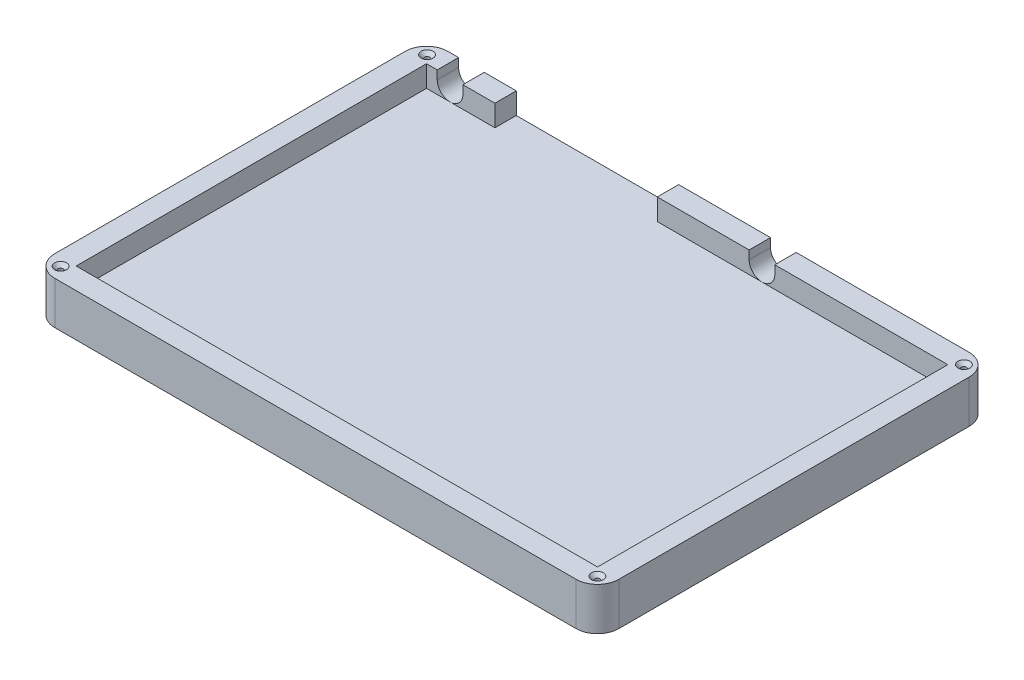
ISO-10303-21;
HEADER;
FILE_DESCRIPTION(('STEP AP214'),'2;1');
FILE_NAME('part.step','',(''),(''),'','','');
FILE_SCHEMA(('AUTOMOTIVE_DESIGN { 1 0 10303 214 1 1 1 1 }'));
ENDSEC;
DATA;
#1=APPLICATION_CONTEXT('core data for automotive mechanical design processes');
#2=APPLICATION_PROTOCOL_DEFINITION('international standard','automotive_design',2000,#1);
#3=PRODUCT_CONTEXT('',#1,'mechanical');
#4=PRODUCT('Part','Part','',(#3));
#5=PRODUCT_RELATED_PRODUCT_CATEGORY('part','',(#4));
#6=PRODUCT_DEFINITION_FORMATION('','',#4);
#7=PRODUCT_DEFINITION_CONTEXT('part definition',#1,'design');
#8=PRODUCT_DEFINITION('design','',#6,#7);
#9=PRODUCT_DEFINITION_SHAPE('','',#8);
#10=(LENGTH_UNIT() NAMED_UNIT(*) SI_UNIT(.MILLI.,.METRE.));
#11=(NAMED_UNIT(*) PLANE_ANGLE_UNIT() SI_UNIT($,.RADIAN.));
#12=(NAMED_UNIT(*) SI_UNIT($,.STERADIAN.) SOLID_ANGLE_UNIT());
#13=UNCERTAINTY_MEASURE_WITH_UNIT(LENGTH_MEASURE(1.E-05),#10,'distance_accuracy_value','');
#14=(GEOMETRIC_REPRESENTATION_CONTEXT(3) GLOBAL_UNCERTAINTY_ASSIGNED_CONTEXT((#13)) GLOBAL_UNIT_ASSIGNED_CONTEXT((#10,
#11,#12)) REPRESENTATION_CONTEXT('',''));
#15=CARTESIAN_POINT('',(0.,0.,0.));
#16=DIRECTION('',(0.,0.,1.));
#17=DIRECTION('',(1.,0.,0.));
#18=AXIS2_PLACEMENT_3D('',#15,#16,#17);
#19=CARTESIAN_POINT('',(-61.,10.,41.));
#20=DIRECTION('',(0.,-1.,0.));
#21=DIRECTION('',(0.,0.,-1.));
#22=AXIS2_PLACEMENT_3D('',#19,#20,#21);
#23=PLANE('',#22);
#24=DIRECTION('',(0.,0.,-1.));
#25=VECTOR('',#24,1.);
#26=CARTESIAN_POINT('',(-52.5,10.,-33.1897503240934));
#27=LINE('',#26,#25);
#28=CARTESIAN_POINT('',(-52.5,10.,-41.));
#29=VERTEX_POINT('',#28);
#30=CARTESIAN_POINT('',(-52.5,10.,-46.));
#31=VERTEX_POINT('',#30);
#32=EDGE_CURVE('E268',#29,#31,#27,.T.);
#33=ORIENTED_EDGE('',*,*,#32,.F.);
#34=DIRECTION('',(-1.,0.,0.));
#35=VECTOR('',#34,1.);
#36=CARTESIAN_POINT('',(-61.,10.,-41.));
#37=LINE('',#36,#35);
#38=CARTESIAN_POINT('',(-45.,10.,-41.));
#39=VERTEX_POINT('',#38);
#40=EDGE_CURVE('E247',#39,#29,#37,.T.);
#41=ORIENTED_EDGE('',*,*,#40,.F.);
#42=DIRECTION('',(0.,0.,1.));
#43=VECTOR('',#42,1.);
#44=CARTESIAN_POINT('',(-45.,10.,-46.));
#45=LINE('',#44,#43);
#46=CARTESIAN_POINT('',(-45.,10.,-46.));
#47=VERTEX_POINT('',#46);
#48=EDGE_CURVE('E306',#47,#39,#45,.T.);
#49=ORIENTED_EDGE('',*,*,#48,.F.);
#50=DIRECTION('',(-1.,0.,0.));
#51=VECTOR('',#50,1.);
#52=CARTESIAN_POINT('',(-61.,10.,-46.));
#53=LINE('',#52,#51);
#54=EDGE_CURVE('E448',#47,#31,#53,.T.);
#55=ORIENTED_EDGE('',*,*,#54,.T.);
#56=EDGE_LOOP('',(#33,#41,#49,#55));
#57=FACE_BOUND('',#56,.T.);
#58=ADVANCED_FACE('F50',(#57),#23,.F.);
#59=CARTESIAN_POINT('',(-61.,10.,-41.));
#60=DIRECTION('',(0.,0.,1.));
#61=DIRECTION('',(1.,0.,0.));
#62=AXIS2_PLACEMENT_3D('',#59,#60,#61);
#63=PLANE('',#62);
#64=CARTESIAN_POINT('',(-55.5,8.,-41.));
#65=DIRECTION('',(0.,0.,1.));
#66=DIRECTION('',(1.,0.,0.));
#67=AXIS2_PLACEMENT_3D('',#64,#65,#66);
#68=CIRCLE('',#67,3.);
#69=CARTESIAN_POINT('',(-55.5,5.,-41.));
#70=VERTEX_POINT('',#69);
#71=CARTESIAN_POINT('',(-58.5,8.,-41.));
#72=VERTEX_POINT('',#71);
#73=EDGE_CURVE('E233',#70,#72,#68,.F.);
#74=ORIENTED_EDGE('',*,*,#73,.T.);
#75=DIRECTION('',(0.,1.,0.));
#76=VECTOR('',#75,1.);
#77=CARTESIAN_POINT('',(-58.5,8.,-41.));
#78=LINE('',#77,#76);
#79=CARTESIAN_POINT('',(-58.5,10.,-41.));
#80=VERTEX_POINT('',#79);
#81=EDGE_CURVE('E257',#72,#80,#78,.T.);
#82=ORIENTED_EDGE('',*,*,#81,.T.);
#83=CARTESIAN_POINT('',(-61.,10.,-41.));
#84=VERTEX_POINT('',#83);
#85=EDGE_CURVE('E396',#80,#84,#37,.T.);
#86=ORIENTED_EDGE('',*,*,#85,.T.);
#87=DIRECTION('',(0.,-1.,0.));
#88=VECTOR('',#87,1.);
#89=CARTESIAN_POINT('',(-61.,10.,-41.));
#90=LINE('',#89,#88);
#91=CARTESIAN_POINT('',(-61.,5.,-41.));
#92=VERTEX_POINT('',#91);
#93=EDGE_CURVE('E405',#84,#92,#90,.T.);
#94=ORIENTED_EDGE('',*,*,#93,.T.);
#95=DIRECTION('',(1.,0.,0.));
#96=VECTOR('',#95,1.);
#97=CARTESIAN_POINT('',(0.,5.,-41.));
#98=LINE('',#97,#96);
#99=EDGE_CURVE('E452',#92,#70,#98,.T.);
#100=ORIENTED_EDGE('',*,*,#99,.T.);
#101=EDGE_LOOP('',(#74,#82,#86,#94,#100));
#102=FACE_BOUND('',#101,.T.);
#103=ADVANCED_FACE('F612',(#102),#63,.T.);
#104=DIRECTION('',(0.,-1.,0.));
#105=VECTOR('',#104,1.);
#106=CARTESIAN_POINT('',(-52.5,10.,-41.));
#107=LINE('',#106,#105);
#108=CARTESIAN_POINT('',(-52.5,8.,-41.));
#109=VERTEX_POINT('',#108);
#110=EDGE_CURVE('E245',#29,#109,#107,.T.);
#111=ORIENTED_EDGE('',*,*,#110,.T.);
#112=EDGE_CURVE('E230',#109,#70,#68,.F.);
#113=ORIENTED_EDGE('',*,*,#112,.T.);
#114=CARTESIAN_POINT('',(-45.,5.,-41.));
#115=VERTEX_POINT('',#114);
#116=EDGE_CURVE('E458',#70,#115,#98,.T.);
#117=ORIENTED_EDGE('',*,*,#116,.T.);
#118=DIRECTION('',(0.,1.,0.));
#119=VECTOR('',#118,1.);
#120=CARTESIAN_POINT('',(-45.,-33.3275357934736,-41.));
#121=LINE('',#120,#119);
#122=EDGE_CURVE('E330',#115,#39,#121,.T.);
#123=ORIENTED_EDGE('',*,*,#122,.T.);
#124=ORIENTED_EDGE('',*,*,#40,.T.);
#125=EDGE_LOOP('',(#111,#113,#117,#123,#124));
#126=FACE_BOUND('',#125,.T.);
#127=ADVANCED_FACE('F246',(#126),#63,.T.);
#128=CARTESIAN_POINT('',(62.8800410539882,10.,-42.8891256748782));
#129=DIRECTION('',(0.,1.,0.));
#130=DIRECTION('',(0.,0.,1.));
#131=AXIS2_PLACEMENT_3D('',#128,#129,#130);
#132=CIRCLE('',#131,1.397);
#133=CARTESIAN_POINT('',(62.8800410539882,10.,-41.4921256748782));
#134=VERTEX_POINT('',#133);
#135=EDGE_CURVE('E319',#134,#134,#132,.T.);
#136=ORIENTED_EDGE('',*,*,#135,.F.);
#137=EDGE_LOOP('',(#136));
#138=FACE_BOUND('',#137,.T.);
#139=CARTESIAN_POINT('',(62.8800410539882,10.,42.8803024114659));
#140=DIRECTION('',(0.,1.,0.));
#141=DIRECTION('',(0.,0.,1.));
#142=AXIS2_PLACEMENT_3D('',#139,#140,#141);
#143=CIRCLE('',#142,1.397);
#144=CARTESIAN_POINT('',(62.8800410539882,10.,44.2773024114659));
#145=VERTEX_POINT('',#144);
#146=EDGE_CURVE('E353',#145,#145,#143,.T.);
#147=ORIENTED_EDGE('',*,*,#146,.F.);
#148=EDGE_LOOP('',(#147));
#149=FACE_BOUND('',#148,.T.);
#150=CARTESIAN_POINT('',(-62.7584309253833,10.,-42.8891256748782));
#151=DIRECTION('',(0.,1.,0.));
#152=DIRECTION('',(0.,0.,1.));
#153=AXIS2_PLACEMENT_3D('',#150,#151,#152);
#154=CIRCLE('',#153,1.397);
#155=CARTESIAN_POINT('',(-62.7584309253833,10.,-41.4921256748782));
#156=VERTEX_POINT('',#155);
#157=EDGE_CURVE('E361',#156,#156,#154,.T.);
#158=ORIENTED_EDGE('',*,*,#157,.F.);
#159=EDGE_LOOP('',(#158));
#160=FACE_BOUND('',#159,.T.);
#161=CARTESIAN_POINT('',(-62.7584309253833,10.,42.8803024114659));
#162=DIRECTION('',(0.,1.,0.));
#163=DIRECTION('',(0.,0.,1.));
#164=AXIS2_PLACEMENT_3D('',#161,#162,#163);
#165=CIRCLE('',#164,1.397);
#166=CARTESIAN_POINT('',(-62.7584309253833,10.,44.2773024114659));
#167=VERTEX_POINT('',#166);
#168=EDGE_CURVE('E374',#167,#167,#165,.T.);
#169=ORIENTED_EDGE('',*,*,#168,.F.);
#170=EDGE_LOOP('',(#169));
#171=FACE_BOUND('',#170,.T.);
#172=ORIENTED_EDGE('',*,*,#85,.F.);
#173=DIRECTION('',(0.,0.,-1.));
#174=VECTOR('',#173,1.);
#175=CARTESIAN_POINT('',(-58.5,10.,-33.1897503240934));
#176=LINE('',#175,#174);
#177=CARTESIAN_POINT('',(-58.5,10.,-46.));
#178=VERTEX_POINT('',#177);
#179=EDGE_CURVE('E263',#80,#178,#176,.T.);
#180=ORIENTED_EDGE('',*,*,#179,.T.);
#181=CARTESIAN_POINT('',(-61.,10.,-46.));
#182=VERTEX_POINT('',#181);
#183=EDGE_CURVE('E438',#178,#182,#53,.T.);
#184=ORIENTED_EDGE('',*,*,#183,.T.);
#185=CARTESIAN_POINT('',(-61.,10.,-41.));
#186=DIRECTION('',(0.,1.,0.));
#187=DIRECTION('',(0.,0.,-1.));
#188=AXIS2_PLACEMENT_3D('',#185,#186,#187);
#189=CIRCLE('',#188,5.);
#190=CARTESIAN_POINT('',(-66.,10.,-41.));
#191=VERTEX_POINT('',#190);
#192=EDGE_CURVE('E441',#182,#191,#189,.T.);
#193=ORIENTED_EDGE('',*,*,#192,.T.);
#194=DIRECTION('',(0.,0.,1.));
#195=VECTOR('',#194,1.);
#196=CARTESIAN_POINT('',(-66.,10.,41.));
#197=LINE('',#196,#195);
#198=CARTESIAN_POINT('',(-66.,10.,41.));
#199=VERTEX_POINT('',#198);
#200=EDGE_CURVE('E447',#191,#199,#197,.T.);
#201=ORIENTED_EDGE('',*,*,#200,.T.);
#202=CARTESIAN_POINT('',(-61.,10.,41.));
#203=DIRECTION('',(0.,1.,0.));
#204=DIRECTION('',(0.,0.,-1.));
#205=AXIS2_PLACEMENT_3D('',#202,#203,#204);
#206=CIRCLE('',#205,5.);
#207=CARTESIAN_POINT('',(-61.,10.,46.));
#208=VERTEX_POINT('',#207);
#209=EDGE_CURVE('E420',#199,#208,#206,.T.);
#210=ORIENTED_EDGE('',*,*,#209,.T.);
#211=DIRECTION('',(1.,0.,0.));
#212=VECTOR('',#211,1.);
#213=CARTESIAN_POINT('',(-61.,10.,46.));
#214=LINE('',#213,#212);
#215=CARTESIAN_POINT('',(61.,10.,46.));
#216=VERTEX_POINT('',#215);
#217=EDGE_CURVE('E421',#208,#216,#214,.T.);
#218=ORIENTED_EDGE('',*,*,#217,.T.);
#219=CARTESIAN_POINT('',(61.,10.,41.));
#220=DIRECTION('',(0.,1.,0.));
#221=DIRECTION('',(0.,0.,1.));
#222=AXIS2_PLACEMENT_3D('',#219,#220,#221);
#223=CIRCLE('',#222,5.);
#224=CARTESIAN_POINT('',(66.,10.,41.));
#225=VERTEX_POINT('',#224);
#226=EDGE_CURVE('E430',#216,#225,#223,.T.);
#227=ORIENTED_EDGE('',*,*,#226,.T.);
#228=DIRECTION('',(0.,0.,-1.));
#229=VECTOR('',#228,1.);
#230=CARTESIAN_POINT('',(66.,10.,41.));
#231=LINE('',#230,#229);
#232=CARTESIAN_POINT('',(66.,10.,-41.));
#233=VERTEX_POINT('',#232);
#234=EDGE_CURVE('E431',#225,#233,#231,.T.);
#235=ORIENTED_EDGE('',*,*,#234,.T.);
#236=CARTESIAN_POINT('',(61.,10.,-41.));
#237=DIRECTION('',(0.,1.,0.));
#238=DIRECTION('',(0.,0.,-1.));
#239=AXIS2_PLACEMENT_3D('',#236,#237,#238);
#240=CIRCLE('',#239,5.);
#241=CARTESIAN_POINT('',(61.,10.,-46.));
#242=VERTEX_POINT('',#241);
#243=EDGE_CURVE('E434',#233,#242,#240,.T.);
#244=ORIENTED_EDGE('',*,*,#243,.T.);
#245=CARTESIAN_POINT('',(20.5,10.,-46.));
#246=VERTEX_POINT('',#245);
#247=EDGE_CURVE('E439',#242,#246,#53,.T.);
#248=ORIENTED_EDGE('',*,*,#247,.T.);
#249=DIRECTION('',(0.,0.,-1.));
#250=VECTOR('',#249,1.);
#251=CARTESIAN_POINT('',(20.5,10.,-33.1897503240934));
#252=LINE('',#251,#250);
#253=CARTESIAN_POINT('',(20.5,10.,-41.));
#254=VERTEX_POINT('',#253);
#255=EDGE_CURVE('E304',#254,#246,#252,.T.);
#256=ORIENTED_EDGE('',*,*,#255,.F.);
#257=CARTESIAN_POINT('',(61.,10.,-41.));
#258=VERTEX_POINT('',#257);
#259=EDGE_CURVE('E400',#258,#254,#37,.T.);
#260=ORIENTED_EDGE('',*,*,#259,.F.);
#261=DIRECTION('',(0.,0.,-1.));
#262=VECTOR('',#261,1.);
#263=CARTESIAN_POINT('',(61.,10.,41.));
#264=LINE('',#263,#262);
#265=CARTESIAN_POINT('',(61.,10.,41.));
#266=VERTEX_POINT('',#265);
#267=EDGE_CURVE('E391',#266,#258,#264,.T.);
#268=ORIENTED_EDGE('',*,*,#267,.F.);
#269=DIRECTION('',(1.,0.,0.));
#270=VECTOR('',#269,1.);
#271=CARTESIAN_POINT('',(-61.,10.,41.));
#272=LINE('',#271,#270);
#273=CARTESIAN_POINT('',(-61.,10.,41.));
#274=VERTEX_POINT('',#273);
#275=EDGE_CURVE('E388',#274,#266,#272,.T.);
#276=ORIENTED_EDGE('',*,*,#275,.F.);
#277=DIRECTION('',(0.,0.,1.));
#278=VECTOR('',#277,1.);
#279=CARTESIAN_POINT('',(-61.,10.,41.));
#280=LINE('',#279,#278);
#281=EDGE_CURVE('E390',#84,#274,#280,.T.);
#282=ORIENTED_EDGE('',*,*,#281,.F.);
#283=EDGE_LOOP('',(#172,#180,#184,#193,#201,#210,#218,#227,#235,#244,#248,#256,#260,#268,#276,#282));
#284=FACE_BOUND('',#283,.T.);
#285=ADVANCED_FACE('F546',(#138,#149,#160,#171,#284),#23,.F.);
#286=CARTESIAN_POINT('',(17.5,8.,-41.));
#287=DIRECTION('',(0.,0.,1.));
#288=DIRECTION('',(1.,0.,0.));
#289=AXIS2_PLACEMENT_3D('',#286,#287,#288);
#290=CIRCLE('',#289,3.);
#291=CARTESIAN_POINT('',(17.5,5.,-41.));
#292=VERTEX_POINT('',#291);
#293=CARTESIAN_POINT('',(14.5,8.,-41.));
#294=VERTEX_POINT('',#293);
#295=EDGE_CURVE('E300',#292,#294,#290,.F.);
#296=ORIENTED_EDGE('',*,*,#295,.T.);
#297=DIRECTION('',(0.,1.,0.));
#298=VECTOR('',#297,1.);
#299=CARTESIAN_POINT('',(14.5,8.,-41.));
#300=LINE('',#299,#298);
#301=CARTESIAN_POINT('',(14.5,10.,-41.));
#302=VERTEX_POINT('',#301);
#303=EDGE_CURVE('E286',#294,#302,#300,.T.);
#304=ORIENTED_EDGE('',*,*,#303,.T.);
#305=CARTESIAN_POINT('',(-6.99999999999999,10.,-41.));
#306=VERTEX_POINT('',#305);
#307=EDGE_CURVE('E401',#302,#306,#37,.T.);
#308=ORIENTED_EDGE('',*,*,#307,.T.);
#309=DIRECTION('',(0.,1.,0.));
#310=VECTOR('',#309,1.);
#311=CARTESIAN_POINT('',(-6.99999999999999,-33.3275357934736,-41.));
#312=LINE('',#311,#310);
#313=CARTESIAN_POINT('',(-6.99999999999999,4.99999999999998,-41.));
#314=VERTEX_POINT('',#313);
#315=EDGE_CURVE('E331',#314,#306,#312,.T.);
#316=ORIENTED_EDGE('',*,*,#315,.F.);
#317=EDGE_CURVE('E463',#314,#292,#98,.T.);
#318=ORIENTED_EDGE('',*,*,#317,.T.);
#319=EDGE_LOOP('',(#296,#304,#308,#316,#318));
#320=FACE_BOUND('',#319,.T.);
#321=ADVANCED_FACE('F591',(#320),#63,.T.);
#322=DIRECTION('',(0.,-1.,0.));
#323=VECTOR('',#322,1.);
#324=CARTESIAN_POINT('',(20.5,10.,-41.));
#325=LINE('',#324,#323);
#326=CARTESIAN_POINT('',(20.5,8.,-41.));
#327=VERTEX_POINT('',#326);
#328=EDGE_CURVE('E277',#254,#327,#325,.T.);
#329=ORIENTED_EDGE('',*,*,#328,.T.);
#330=EDGE_CURVE('E291',#327,#292,#290,.F.);
#331=ORIENTED_EDGE('',*,*,#330,.T.);
#332=CARTESIAN_POINT('',(61.,5.,-41.));
#333=VERTEX_POINT('',#332);
#334=EDGE_CURVE('E453',#292,#333,#98,.T.);
#335=ORIENTED_EDGE('',*,*,#334,.T.);
#336=DIRECTION('',(0.,-1.,0.));
#337=VECTOR('',#336,1.);
#338=CARTESIAN_POINT('',(61.,10.,-41.));
#339=LINE('',#338,#337);
#340=EDGE_CURVE('E410',#258,#333,#339,.T.);
#341=ORIENTED_EDGE('',*,*,#340,.F.);
#342=ORIENTED_EDGE('',*,*,#259,.T.);
#343=EDGE_LOOP('',(#329,#331,#335,#341,#342));
#344=FACE_BOUND('',#343,.T.);
#345=ADVANCED_FACE('F570',(#344),#63,.T.);
#346=ORIENTED_EDGE('',*,*,#307,.F.);
#347=DIRECTION('',(0.,0.,-1.));
#348=VECTOR('',#347,1.);
#349=CARTESIAN_POINT('',(14.5,10.,-33.1897503240934));
#350=LINE('',#349,#348);
#351=CARTESIAN_POINT('',(14.5,10.,-46.));
#352=VERTEX_POINT('',#351);
#353=EDGE_CURVE('E292',#302,#352,#350,.T.);
#354=ORIENTED_EDGE('',*,*,#353,.T.);
#355=CARTESIAN_POINT('',(-6.99999999999999,10.,-46.));
#356=VERTEX_POINT('',#355);
#357=EDGE_CURVE('E443',#352,#356,#53,.T.);
#358=ORIENTED_EDGE('',*,*,#357,.T.);
#359=DIRECTION('',(0.,0.,-1.));
#360=VECTOR('',#359,1.);
#361=CARTESIAN_POINT('',(-6.99999999999999,10.,-46.));
#362=LINE('',#361,#360);
#363=EDGE_CURVE('E323',#306,#356,#362,.T.);
#364=ORIENTED_EDGE('',*,*,#363,.F.);
#365=EDGE_LOOP('',(#346,#354,#358,#364));
#366=FACE_BOUND('',#365,.T.);
#367=ADVANCED_FACE('F597',(#366),#23,.F.);
#368=CARTESIAN_POINT('',(-61.,5.,-41.));
#369=DIRECTION('',(0.,-1.,0.));
#370=DIRECTION('',(0.,0.,-1.));
#371=AXIS2_PLACEMENT_3D('',#368,#369,#370);
#372=CYLINDRICAL_SURFACE('',#371,5.);
#373=CARTESIAN_POINT('',(-61.,0.,-41.));
#374=DIRECTION('',(0.,1.,0.));
#375=DIRECTION('',(0.,0.,1.));
#376=AXIS2_PLACEMENT_3D('',#373,#374,#375);
#377=CIRCLE('',#376,5.);
#378=CARTESIAN_POINT('',(-66.,0.,-41.));
#379=VERTEX_POINT('',#378);
#380=CARTESIAN_POINT('',(-61.,0.,-46.));
#381=VERTEX_POINT('',#380);
#382=EDGE_CURVE('E471',#379,#381,#377,.F.);
#383=ORIENTED_EDGE('',*,*,#382,.F.);
#384=DIRECTION('',(0.,-1.,0.));
#385=VECTOR('',#384,1.);
#386=CARTESIAN_POINT('',(-66.,5.,-41.));
#387=LINE('',#386,#385);
#388=EDGE_CURVE('E11',#191,#379,#387,.T.);
#389=ORIENTED_EDGE('',*,*,#388,.F.);
#390=ORIENTED_EDGE('',*,*,#192,.F.);
#391=DIRECTION('',(0.,-1.,0.));
#392=VECTOR('',#391,1.);
#393=CARTESIAN_POINT('',(-61.,5.,-46.));
#394=LINE('',#393,#392);
#395=EDGE_CURVE('E501',#182,#381,#394,.T.);
#396=ORIENTED_EDGE('',*,*,#395,.T.);
#397=EDGE_LOOP('',(#383,#389,#390,#396));
#398=FACE_BOUND('',#397,.T.);
#399=ADVANCED_FACE('F47',(#398),#372,.T.);
#400=CARTESIAN_POINT('',(-66.,5.,0.));
#401=DIRECTION('',(-1.,0.,0.));
#402=DIRECTION('',(0.,0.,1.));
#403=AXIS2_PLACEMENT_3D('',#400,#401,#402);
#404=PLANE('',#403);
#405=DIRECTION('',(0.,0.,-1.));
#406=VECTOR('',#405,1.);
#407=CARTESIAN_POINT('',(-66.,0.,0.));
#408=LINE('',#407,#406);
#409=CARTESIAN_POINT('',(-66.,0.,41.));
#410=VERTEX_POINT('',#409);
#411=EDGE_CURVE('E480',#410,#379,#408,.T.);
#412=ORIENTED_EDGE('',*,*,#411,.F.);
#413=DIRECTION('',(0.,-1.,0.));
#414=VECTOR('',#413,1.);
#415=CARTESIAN_POINT('',(-66.,5.,41.));
#416=LINE('',#415,#414);
#417=EDGE_CURVE('E57',#199,#410,#416,.T.);
#418=ORIENTED_EDGE('',*,*,#417,.F.);
#419=ORIENTED_EDGE('',*,*,#200,.F.);
#420=ORIENTED_EDGE('',*,*,#388,.T.);
#421=EDGE_LOOP('',(#412,#418,#419,#420));
#422=FACE_BOUND('',#421,.T.);
#423=ADVANCED_FACE('F529',(#422),#404,.T.);
#424=CARTESIAN_POINT('',(-61.,5.,41.));
#425=DIRECTION('',(0.,-1.,0.));
#426=DIRECTION('',(0.,0.,-1.));
#427=AXIS2_PLACEMENT_3D('',#424,#425,#426);
#428=CYLINDRICAL_SURFACE('',#427,5.);
#429=CARTESIAN_POINT('',(-61.,0.,41.));
#430=DIRECTION('',(0.,1.,0.));
#431=DIRECTION('',(0.,0.,1.));
#432=AXIS2_PLACEMENT_3D('',#429,#430,#431);
#433=CIRCLE('',#432,5.);
#434=CARTESIAN_POINT('',(-61.,0.,46.));
#435=VERTEX_POINT('',#434);
#436=EDGE_CURVE('E481',#435,#410,#433,.F.);
#437=ORIENTED_EDGE('',*,*,#436,.F.);
#438=DIRECTION('',(0.,-1.,0.));
#439=VECTOR('',#438,1.);
#440=CARTESIAN_POINT('',(-61.,5.,46.));
#441=LINE('',#440,#439);
#442=EDGE_CURVE('E517',#208,#435,#441,.T.);
#443=ORIENTED_EDGE('',*,*,#442,.F.);
#444=ORIENTED_EDGE('',*,*,#209,.F.);
#445=ORIENTED_EDGE('',*,*,#417,.T.);
#446=EDGE_LOOP('',(#437,#443,#444,#445));
#447=FACE_BOUND('',#446,.T.);
#448=ADVANCED_FACE('F527',(#447),#428,.T.);
#449=CARTESIAN_POINT('',(0.,5.,46.));
#450=DIRECTION('',(0.,0.,-1.));
#451=DIRECTION('',(-1.,0.,0.));
#452=AXIS2_PLACEMENT_3D('',#449,#450,#451);
#453=PLANE('',#452);
#454=DIRECTION('',(1.,0.,0.));
#455=VECTOR('',#454,1.);
#456=CARTESIAN_POINT('',(0.,0.,46.));
#457=LINE('',#456,#455);
#458=CARTESIAN_POINT('',(61.,0.,46.));
#459=VERTEX_POINT('',#458);
#460=EDGE_CURVE('E484',#435,#459,#457,.T.);
#461=ORIENTED_EDGE('',*,*,#460,.T.);
#462=DIRECTION('',(0.,-1.,0.));
#463=VECTOR('',#462,1.);
#464=CARTESIAN_POINT('',(61.,5.,46.));
#465=LINE('',#464,#463);
#466=EDGE_CURVE('E518',#216,#459,#465,.T.);
#467=ORIENTED_EDGE('',*,*,#466,.F.);
#468=ORIENTED_EDGE('',*,*,#217,.F.);
#469=ORIENTED_EDGE('',*,*,#442,.T.);
#470=EDGE_LOOP('',(#461,#467,#468,#469));
#471=FACE_BOUND('',#470,.T.);
#472=ADVANCED_FACE('F538',(#471),#453,.F.);
#473=CARTESIAN_POINT('',(61.,5.,41.));
#474=DIRECTION('',(0.,-1.,0.));
#475=DIRECTION('',(0.,0.,-1.));
#476=AXIS2_PLACEMENT_3D('',#473,#474,#475);
#477=CYLINDRICAL_SURFACE('',#476,5.);
#478=CARTESIAN_POINT('',(61.,0.,41.));
#479=DIRECTION('',(0.,1.,0.));
#480=DIRECTION('',(0.,0.,1.));
#481=AXIS2_PLACEMENT_3D('',#478,#479,#480);
#482=CIRCLE('',#481,5.);
#483=CARTESIAN_POINT('',(66.,0.,41.));
#484=VERTEX_POINT('',#483);
#485=EDGE_CURVE('E488',#459,#484,#482,.T.);
#486=ORIENTED_EDGE('',*,*,#485,.T.);
#487=DIRECTION('',(0.,-1.,0.));
#488=VECTOR('',#487,1.);
#489=CARTESIAN_POINT('',(66.,5.,41.));
#490=LINE('',#489,#488);
#491=EDGE_CURVE('E515',#225,#484,#490,.T.);
#492=ORIENTED_EDGE('',*,*,#491,.F.);
#493=ORIENTED_EDGE('',*,*,#226,.F.);
#494=ORIENTED_EDGE('',*,*,#466,.T.);
#495=EDGE_LOOP('',(#486,#492,#493,#494));
#496=FACE_BOUND('',#495,.T.);
#497=ADVANCED_FACE('F545',(#496),#477,.T.);
#498=CARTESIAN_POINT('',(66.,5.,0.));
#499=DIRECTION('',(-1.,0.,0.));
#500=DIRECTION('',(0.,0.,1.));
#501=AXIS2_PLACEMENT_3D('',#498,#499,#500);
#502=PLANE('',#501);
#503=DIRECTION('',(0.,0.,-1.));
#504=VECTOR('',#503,1.);
#505=CARTESIAN_POINT('',(66.,0.,0.));
#506=LINE('',#505,#504);
#507=CARTESIAN_POINT('',(66.,0.,-41.));
#508=VERTEX_POINT('',#507);
#509=EDGE_CURVE('E491',#484,#508,#506,.T.);
#510=ORIENTED_EDGE('',*,*,#509,.T.);
#511=DIRECTION('',(0.,-1.,0.));
#512=VECTOR('',#511,1.);
#513=CARTESIAN_POINT('',(66.,5.,-41.));
#514=LINE('',#513,#512);
#515=EDGE_CURVE('E508',#233,#508,#514,.T.);
#516=ORIENTED_EDGE('',*,*,#515,.F.);
#517=ORIENTED_EDGE('',*,*,#234,.F.);
#518=ORIENTED_EDGE('',*,*,#491,.T.);
#519=EDGE_LOOP('',(#510,#516,#517,#518));
#520=FACE_BOUND('',#519,.T.);
#521=ADVANCED_FACE('F548',(#520),#502,.F.);
#522=CARTESIAN_POINT('',(61.,5.,-41.));
#523=DIRECTION('',(0.,-1.,0.));
#524=DIRECTION('',(0.,0.,-1.));
#525=AXIS2_PLACEMENT_3D('',#522,#523,#524);
#526=CYLINDRICAL_SURFACE('',#525,5.);
#527=CARTESIAN_POINT('',(61.,0.,-41.));
#528=DIRECTION('',(0.,1.,0.));
#529=DIRECTION('',(0.,0.,1.));
#530=AXIS2_PLACEMENT_3D('',#527,#528,#529);
#531=CIRCLE('',#530,5.);
#532=CARTESIAN_POINT('',(61.,0.,-46.));
#533=VERTEX_POINT('',#532);
#534=EDGE_CURVE('E494',#533,#508,#531,.F.);
#535=ORIENTED_EDGE('',*,*,#534,.F.);
#536=DIRECTION('',(0.,-1.,0.));
#537=VECTOR('',#536,1.);
#538=CARTESIAN_POINT('',(61.,5.,-46.));
#539=LINE('',#538,#537);
#540=EDGE_CURVE('E509',#242,#533,#539,.T.);
#541=ORIENTED_EDGE('',*,*,#540,.F.);
#542=ORIENTED_EDGE('',*,*,#243,.F.);
#543=ORIENTED_EDGE('',*,*,#515,.T.);
#544=EDGE_LOOP('',(#535,#541,#542,#543));
#545=FACE_BOUND('',#544,.T.);
#546=ADVANCED_FACE('F555',(#545),#526,.T.);
#547=CARTESIAN_POINT('',(0.,5.,-46.));
#548=DIRECTION('',(0.,0.,-1.));
#549=DIRECTION('',(-1.,0.,0.));
#550=AXIS2_PLACEMENT_3D('',#547,#548,#549);
#551=PLANE('',#550);
#552=DIRECTION('',(0.,-1.,0.));
#553=VECTOR('',#552,1.);
#554=CARTESIAN_POINT('',(-52.5,10.,-46.));
#555=LINE('',#554,#553);
#556=CARTESIAN_POINT('',(-52.5,8.,-46.));
#557=VERTEX_POINT('',#556);
#558=EDGE_CURVE('E61',#31,#557,#555,.T.);
#559=ORIENTED_EDGE('',*,*,#558,.F.);
#560=ORIENTED_EDGE('',*,*,#54,.F.);
#561=DIRECTION('',(0.,1.,0.));
#562=VECTOR('',#561,1.);
#563=CARTESIAN_POINT('',(-45.,-33.3275357934736,-46.));
#564=LINE('',#563,#562);
#565=CARTESIAN_POINT('',(-45.,5.,-46.));
#566=VERTEX_POINT('',#565);
#567=EDGE_CURVE('E311',#566,#47,#564,.T.);
#568=ORIENTED_EDGE('',*,*,#567,.F.);
#569=DIRECTION('',(1.,0.,0.));
#570=VECTOR('',#569,1.);
#571=CARTESIAN_POINT('',(-45.,5.,-46.));
#572=LINE('',#571,#570);
#573=CARTESIAN_POINT('',(-6.99999999999999,5.,-46.));
#574=VERTEX_POINT('',#573);
#575=EDGE_CURVE('E315',#566,#574,#572,.T.);
#576=ORIENTED_EDGE('',*,*,#575,.T.);
#577=DIRECTION('',(0.,1.,0.));
#578=VECTOR('',#577,1.);
#579=CARTESIAN_POINT('',(-6.99999999999999,-33.3275357934736,-46.));
#580=LINE('',#579,#578);
#581=EDGE_CURVE('E329',#574,#356,#580,.T.);
#582=ORIENTED_EDGE('',*,*,#581,.T.);
#583=ORIENTED_EDGE('',*,*,#357,.F.);
#584=DIRECTION('',(0.,1.,0.));
#585=VECTOR('',#584,1.);
#586=CARTESIAN_POINT('',(14.5,8.,-46.));
#587=LINE('',#586,#585);
#588=CARTESIAN_POINT('',(14.5,8.,-46.));
#589=VERTEX_POINT('',#588);
#590=EDGE_CURVE('E272',#589,#352,#587,.T.);
#591=ORIENTED_EDGE('',*,*,#590,.F.);
#592=CARTESIAN_POINT('',(17.5,8.,-46.));
#593=DIRECTION('',(0.,0.,-1.));
#594=DIRECTION('',(-1.,0.,0.));
#595=AXIS2_PLACEMENT_3D('',#592,#593,#594);
#596=CIRCLE('',#595,3.);
#597=CARTESIAN_POINT('',(20.5,8.,-46.));
#598=VERTEX_POINT('',#597);
#599=EDGE_CURVE('E280',#598,#589,#596,.T.);
#600=ORIENTED_EDGE('',*,*,#599,.F.);
#601=DIRECTION('',(0.,-1.,0.));
#602=VECTOR('',#601,1.);
#603=CARTESIAN_POINT('',(20.5,10.,-46.));
#604=LINE('',#603,#602);
#605=EDGE_CURVE('E72',#246,#598,#604,.T.);
#606=ORIENTED_EDGE('',*,*,#605,.F.);
#607=ORIENTED_EDGE('',*,*,#247,.F.);
#608=ORIENTED_EDGE('',*,*,#540,.T.);
#609=DIRECTION('',(1.,0.,0.));
#610=VECTOR('',#609,1.);
#611=CARTESIAN_POINT('',(0.,0.,-46.));
#612=LINE('',#611,#610);
#613=EDGE_CURVE('E496',#381,#533,#612,.T.);
#614=ORIENTED_EDGE('',*,*,#613,.F.);
#615=ORIENTED_EDGE('',*,*,#395,.F.);
#616=ORIENTED_EDGE('',*,*,#183,.F.);
#617=DIRECTION('',(0.,1.,0.));
#618=VECTOR('',#617,1.);
#619=CARTESIAN_POINT('',(-58.5,8.,-46.));
#620=LINE('',#619,#618);
#621=CARTESIAN_POINT('',(-58.5,8.,-46.));
#622=VERTEX_POINT('',#621);
#623=EDGE_CURVE('E252',#622,#178,#620,.T.);
#624=ORIENTED_EDGE('',*,*,#623,.F.);
#625=CARTESIAN_POINT('',(-55.5,8.,-46.));
#626=DIRECTION('',(0.,0.,-1.));
#627=DIRECTION('',(-1.,0.,0.));
#628=AXIS2_PLACEMENT_3D('',#625,#626,#627);
#629=CIRCLE('',#628,3.);
#630=EDGE_CURVE('E254',#557,#622,#629,.T.);
#631=ORIENTED_EDGE('',*,*,#630,.F.);
#632=EDGE_LOOP('',(#559,#560,#568,#576,#582,#583,#591,#600,#606,#607,#608,#614,#615,#616,#624,#631));
#633=FACE_BOUND('',#632,.T.);
#634=ADVANCED_FACE('F558',(#633),#551,.T.);
#635=CARTESIAN_POINT('',(0.,0.,0.));
#636=DIRECTION('',(0.,1.,0.));
#637=DIRECTION('',(0.,0.,1.));
#638=AXIS2_PLACEMENT_3D('',#635,#636,#637);
#639=PLANE('',#638);
#640=ORIENTED_EDGE('',*,*,#382,.T.);
#641=ORIENTED_EDGE('',*,*,#613,.T.);
#642=ORIENTED_EDGE('',*,*,#534,.T.);
#643=ORIENTED_EDGE('',*,*,#509,.F.);
#644=ORIENTED_EDGE('',*,*,#485,.F.);
#645=ORIENTED_EDGE('',*,*,#460,.F.);
#646=ORIENTED_EDGE('',*,*,#436,.T.);
#647=ORIENTED_EDGE('',*,*,#411,.T.);
#648=EDGE_LOOP('',(#640,#641,#642,#643,#644,#645,#646,#647));
#649=FACE_BOUND('',#648,.T.);
#650=ADVANCED_FACE('F534',(#649),#639,.F.);
#651=CARTESIAN_POINT('',(-61.,10.,41.));
#652=DIRECTION('',(1.,0.,0.));
#653=DIRECTION('',(0.,0.,-1.));
#654=AXIS2_PLACEMENT_3D('',#651,#652,#653);
#655=PLANE('',#654);
#656=DIRECTION('',(0.,-1.,0.));
#657=VECTOR('',#656,1.);
#658=CARTESIAN_POINT('',(-61.,10.,41.));
#659=LINE('',#658,#657);
#660=CARTESIAN_POINT('',(-61.,5.,41.));
#661=VERTEX_POINT('',#660);
#662=EDGE_CURVE('E412',#274,#661,#659,.T.);
#663=ORIENTED_EDGE('',*,*,#662,.T.);
#664=DIRECTION('',(0.,0.,-1.));
#665=VECTOR('',#664,1.);
#666=CARTESIAN_POINT('',(-61.,5.,0.));
#667=LINE('',#666,#665);
#668=EDGE_CURVE('E468',#661,#92,#667,.T.);
#669=ORIENTED_EDGE('',*,*,#668,.T.);
#670=ORIENTED_EDGE('',*,*,#93,.F.);
#671=ORIENTED_EDGE('',*,*,#281,.T.);
#672=EDGE_LOOP('',(#663,#669,#670,#671));
#673=FACE_BOUND('',#672,.T.);
#674=ADVANCED_FACE('F583',(#673),#655,.T.);
#675=CARTESIAN_POINT('',(-61.,10.,41.));
#676=DIRECTION('',(0.,0.,-1.));
#677=DIRECTION('',(-1.,0.,0.));
#678=AXIS2_PLACEMENT_3D('',#675,#676,#677);
#679=PLANE('',#678);
#680=DIRECTION('',(0.,-1.,0.));
#681=VECTOR('',#680,1.);
#682=CARTESIAN_POINT('',(61.,10.,41.));
#683=LINE('',#682,#681);
#684=CARTESIAN_POINT('',(61.,5.,41.));
#685=VERTEX_POINT('',#684);
#686=EDGE_CURVE('E414',#266,#685,#683,.T.);
#687=ORIENTED_EDGE('',*,*,#686,.T.);
#688=DIRECTION('',(-1.,0.,0.));
#689=VECTOR('',#688,1.);
#690=CARTESIAN_POINT('',(0.,5.,41.));
#691=LINE('',#690,#689);
#692=EDGE_CURVE('E462',#685,#661,#691,.T.);
#693=ORIENTED_EDGE('',*,*,#692,.T.);
#694=ORIENTED_EDGE('',*,*,#662,.F.);
#695=ORIENTED_EDGE('',*,*,#275,.T.);
#696=EDGE_LOOP('',(#687,#693,#694,#695));
#697=FACE_BOUND('',#696,.T.);
#698=ADVANCED_FACE('F580',(#697),#679,.T.);
#699=CARTESIAN_POINT('',(61.,10.,41.));
#700=DIRECTION('',(-1.,0.,0.));
#701=DIRECTION('',(0.,0.,1.));
#702=AXIS2_PLACEMENT_3D('',#699,#700,#701);
#703=PLANE('',#702);
#704=ORIENTED_EDGE('',*,*,#340,.T.);
#705=DIRECTION('',(0.,0.,1.));
#706=VECTOR('',#705,1.);
#707=CARTESIAN_POINT('',(61.,5.,0.));
#708=LINE('',#707,#706);
#709=EDGE_CURVE('E459',#333,#685,#708,.T.);
#710=ORIENTED_EDGE('',*,*,#709,.T.);
#711=ORIENTED_EDGE('',*,*,#686,.F.);
#712=ORIENTED_EDGE('',*,*,#267,.T.);
#713=EDGE_LOOP('',(#704,#710,#711,#712));
#714=FACE_BOUND('',#713,.T.);
#715=ADVANCED_FACE('F572',(#714),#703,.T.);
#716=CARTESIAN_POINT('',(0.,5.,0.));
#717=DIRECTION('',(0.,1.,0.));
#718=DIRECTION('',(0.,0.,1.));
#719=AXIS2_PLACEMENT_3D('',#716,#717,#718);
#720=PLANE('',#719);
#721=ORIENTED_EDGE('',*,*,#668,.F.);
#722=ORIENTED_EDGE('',*,*,#692,.F.);
#723=ORIENTED_EDGE('',*,*,#709,.F.);
#724=ORIENTED_EDGE('',*,*,#334,.F.);
#725=ORIENTED_EDGE('',*,*,#317,.F.);
#726=DIRECTION('',(0.,0.,1.));
#727=VECTOR('',#726,1.);
#728=CARTESIAN_POINT('',(-6.99999999999999,5.,-46.));
#729=LINE('',#728,#727);
#730=EDGE_CURVE('E310',#574,#314,#729,.T.);
#731=ORIENTED_EDGE('',*,*,#730,.F.);
#732=ORIENTED_EDGE('',*,*,#575,.F.);
#733=DIRECTION('',(0.,0.,-1.));
#734=VECTOR('',#733,1.);
#735=CARTESIAN_POINT('',(-45.,5.,-46.));
#736=LINE('',#735,#734);
#737=EDGE_CURVE('E320',#115,#566,#736,.T.);
#738=ORIENTED_EDGE('',*,*,#737,.F.);
#739=ORIENTED_EDGE('',*,*,#116,.F.);
#740=ORIENTED_EDGE('',*,*,#99,.F.);
#741=EDGE_LOOP('',(#721,#722,#723,#724,#725,#731,#732,#738,#739,#740));
#742=FACE_BOUND('',#741,.T.);
#743=ADVANCED_FACE('F658',(#742),#720,.T.);
#744=CARTESIAN_POINT('',(-62.7584309253833,6.35789061051139,42.8803024114659));
#745=DIRECTION('',(0.,1.,0.));
#746=DIRECTION('',(0.,0.,1.));
#747=AXIS2_PLACEMENT_3D('',#744,#745,#746);
#748=CONICAL_SURFACE('',#747,0.59563,1.02974425867665);
#749=CARTESIAN_POINT('',(-62.7584309253833,6.,42.8803024114659));
#750=VERTEX_POINT('',#749);
#751=VERTEX_LOOP('',#750);
#752=FACE_BOUND('',#751,.T.);
#753=CARTESIAN_POINT('',(-62.7584309253833,6.35789061051139,42.8803024114659));
#754=DIRECTION('',(0.,1.,0.));
#755=DIRECTION('',(0.,0.,1.));
#756=AXIS2_PLACEMENT_3D('',#753,#754,#755);
#757=CIRCLE('',#756,0.59563);
#758=CARTESIAN_POINT('',(-62.7584309253833,6.35789061051139,43.4759324114659));
#759=VERTEX_POINT('',#758);
#760=EDGE_CURVE('E382',#759,#759,#757,.T.);
#761=ORIENTED_EDGE('',*,*,#760,.T.);
#762=EDGE_LOOP('',(#761));
#763=FACE_BOUND('',#762,.T.);
#764=ADVANCED_FACE('F655',(#752,#763),#748,.F.);
#765=CARTESIAN_POINT('',(-62.7584309253833,10.,42.8803024114659));
#766=DIRECTION('',(0.,1.,0.));
#767=DIRECTION('',(0.,0.,1.));
#768=AXIS2_PLACEMENT_3D('',#765,#766,#767);
#769=CYLINDRICAL_SURFACE('',#768,0.59563);
#770=ORIENTED_EDGE('',*,*,#760,.F.);
#771=EDGE_LOOP('',(#770));
#772=FACE_BOUND('',#771,.T.);
#773=CARTESIAN_POINT('',(-62.7584309253833,9.19863,42.8803024114659));
#774=DIRECTION('',(0.,1.,0.));
#775=DIRECTION('',(0.,0.,1.));
#776=AXIS2_PLACEMENT_3D('',#773,#774,#775);
#777=CIRCLE('',#776,0.59563);
#778=CARTESIAN_POINT('',(-62.7584309253833,9.19863,43.4759324114659));
#779=VERTEX_POINT('',#778);
#780=EDGE_CURVE('E377',#779,#779,#777,.T.);
#781=ORIENTED_EDGE('',*,*,#780,.T.);
#782=EDGE_LOOP('',(#781));
#783=FACE_BOUND('',#782,.T.);
#784=ADVANCED_FACE('F645',(#772,#783),#769,.F.);
#785=CARTESIAN_POINT('',(-62.7584309253833,10.,42.8803024114659));
#786=DIRECTION('',(0.,1.,0.));
#787=DIRECTION('',(0.,0.,1.));
#788=AXIS2_PLACEMENT_3D('',#785,#786,#787);
#789=CONICAL_SURFACE('',#788,1.397,0.785398163397449);
#790=ORIENTED_EDGE('',*,*,#780,.F.);
#791=EDGE_LOOP('',(#790));
#792=FACE_BOUND('',#791,.T.);
#793=ORIENTED_EDGE('',*,*,#168,.T.);
#794=EDGE_LOOP('',(#793));
#795=FACE_BOUND('',#794,.T.);
#796=ADVANCED_FACE('F640',(#792,#795),#789,.F.);
#797=CARTESIAN_POINT('',(-62.7584309253833,6.35789061051139,-42.8891256748782));
#798=DIRECTION('',(0.,1.,0.));
#799=DIRECTION('',(0.,0.,1.));
#800=AXIS2_PLACEMENT_3D('',#797,#798,#799);
#801=CONICAL_SURFACE('',#800,0.59563,1.02974425867665);
#802=CARTESIAN_POINT('',(-62.7584309253833,6.,-42.8891256748782));
#803=VERTEX_POINT('',#802);
#804=VERTEX_LOOP('',#803);
#805=FACE_BOUND('',#804,.T.);
#806=CARTESIAN_POINT('',(-62.7584309253833,6.35789061051139,-42.8891256748782));
#807=DIRECTION('',(0.,1.,0.));
#808=DIRECTION('',(0.,0.,1.));
#809=AXIS2_PLACEMENT_3D('',#806,#807,#808);
#810=CIRCLE('',#809,0.59563);
#811=CARTESIAN_POINT('',(-62.7584309253833,6.35789061051139,-42.2934956748782));
#812=VERTEX_POINT('',#811);
#813=EDGE_CURVE('E371',#812,#812,#810,.T.);
#814=ORIENTED_EDGE('',*,*,#813,.T.);
#815=EDGE_LOOP('',(#814));
#816=FACE_BOUND('',#815,.T.);
#817=ADVANCED_FACE('F643',(#805,#816),#801,.F.);
#818=CARTESIAN_POINT('',(-62.7584309253833,10.,-42.8891256748782));
#819=DIRECTION('',(0.,1.,0.));
#820=DIRECTION('',(0.,0.,1.));
#821=AXIS2_PLACEMENT_3D('',#818,#819,#820);
#822=CYLINDRICAL_SURFACE('',#821,0.59563);
#823=ORIENTED_EDGE('',*,*,#813,.F.);
#824=EDGE_LOOP('',(#823));
#825=FACE_BOUND('',#824,.T.);
#826=CARTESIAN_POINT('',(-62.7584309253833,9.19863,-42.8891256748782));
#827=DIRECTION('',(0.,1.,0.));
#828=DIRECTION('',(0.,0.,1.));
#829=AXIS2_PLACEMENT_3D('',#826,#827,#828);
#830=CIRCLE('',#829,0.59563);
#831=CARTESIAN_POINT('',(-62.7584309253833,9.19863,-42.2934956748782));
#832=VERTEX_POINT('',#831);
#833=EDGE_CURVE('E370',#832,#832,#830,.T.);
#834=ORIENTED_EDGE('',*,*,#833,.T.);
#835=EDGE_LOOP('',(#834));
#836=FACE_BOUND('',#835,.T.);
#837=ADVANCED_FACE('F647',(#825,#836),#822,.F.);
#838=CARTESIAN_POINT('',(-62.7584309253833,10.,-42.8891256748782));
#839=DIRECTION('',(0.,1.,0.));
#840=DIRECTION('',(0.,0.,1.));
#841=AXIS2_PLACEMENT_3D('',#838,#839,#840);
#842=CONICAL_SURFACE('',#841,1.397,0.785398163397449);
#843=ORIENTED_EDGE('',*,*,#833,.F.);
#844=EDGE_LOOP('',(#843));
#845=FACE_BOUND('',#844,.T.);
#846=ORIENTED_EDGE('',*,*,#157,.T.);
#847=EDGE_LOOP('',(#846));
#848=FACE_BOUND('',#847,.T.);
#849=ADVANCED_FACE('F767',(#845,#848),#842,.F.);
#850=CARTESIAN_POINT('',(62.8800410539882,6.35789061051139,42.8803024114659));
#851=DIRECTION('',(0.,1.,0.));
#852=DIRECTION('',(0.,0.,1.));
#853=AXIS2_PLACEMENT_3D('',#850,#851,#852);
#854=CONICAL_SURFACE('',#853,0.59563,1.02974425867665);
#855=CARTESIAN_POINT('',(62.8800410539882,6.,42.8803024114659));
#856=VERTEX_POINT('',#855);
#857=VERTEX_LOOP('',#856);
#858=FACE_BOUND('',#857,.T.);
#859=CARTESIAN_POINT('',(62.8800410539882,6.35789061051139,42.8803024114659));
#860=DIRECTION('',(0.,1.,0.));
#861=DIRECTION('',(0.,0.,1.));
#862=AXIS2_PLACEMENT_3D('',#859,#860,#861);
#863=CIRCLE('',#862,0.59563);
#864=CARTESIAN_POINT('',(62.8800410539882,6.35789061051139,43.4759324114659));
#865=VERTEX_POINT('',#864);
#866=EDGE_CURVE('E358',#865,#865,#863,.T.);
#867=ORIENTED_EDGE('',*,*,#866,.T.);
#868=EDGE_LOOP('',(#867));
#869=FACE_BOUND('',#868,.T.);
#870=ADVANCED_FACE('F780',(#858,#869),#854,.F.);
#871=CARTESIAN_POINT('',(62.8800410539882,10.,42.8803024114659));
#872=DIRECTION('',(0.,1.,0.));
#873=DIRECTION('',(0.,0.,1.));
#874=AXIS2_PLACEMENT_3D('',#871,#872,#873);
#875=CYLINDRICAL_SURFACE('',#874,0.59563);
#876=ORIENTED_EDGE('',*,*,#866,.F.);
#877=EDGE_LOOP('',(#876));
#878=FACE_BOUND('',#877,.T.);
#879=CARTESIAN_POINT('',(62.8800410539882,9.19863,42.8803024114659));
#880=DIRECTION('',(0.,1.,0.));
#881=DIRECTION('',(0.,0.,1.));
#882=AXIS2_PLACEMENT_3D('',#879,#880,#881);
#883=CIRCLE('',#882,0.59563);
#884=CARTESIAN_POINT('',(62.8800410539882,9.19863,43.4759324114659));
#885=VERTEX_POINT('',#884);
#886=EDGE_CURVE('E352',#885,#885,#883,.T.);
#887=ORIENTED_EDGE('',*,*,#886,.T.);
#888=EDGE_LOOP('',(#887));
#889=FACE_BOUND('',#888,.T.);
#890=ADVANCED_FACE('F790',(#878,#889),#875,.F.);
#891=CARTESIAN_POINT('',(62.8800410539882,10.,42.8803024114659));
#892=DIRECTION('',(0.,1.,0.));
#893=DIRECTION('',(0.,0.,1.));
#894=AXIS2_PLACEMENT_3D('',#891,#892,#893);
#895=CONICAL_SURFACE('',#894,1.397,0.785398163397445);
#896=ORIENTED_EDGE('',*,*,#886,.F.);
#897=EDGE_LOOP('',(#896));
#898=FACE_BOUND('',#897,.T.);
#899=ORIENTED_EDGE('',*,*,#146,.T.);
#900=EDGE_LOOP('',(#899));
#901=FACE_BOUND('',#900,.T.);
#902=ADVANCED_FACE('F796',(#898,#901),#895,.F.);
#903=CARTESIAN_POINT('',(62.8800410539882,6.35789061051139,-42.8891256748782));
#904=DIRECTION('',(0.,1.,0.));
#905=DIRECTION('',(0.,0.,1.));
#906=AXIS2_PLACEMENT_3D('',#903,#904,#905);
#907=CONICAL_SURFACE('',#906,0.59563,1.02974425867665);
#908=CARTESIAN_POINT('',(62.8800410539882,6.,-42.8891256748782));
#909=VERTEX_POINT('',#908);
#910=VERTEX_LOOP('',#909);
#911=FACE_BOUND('',#910,.T.);
#912=CARTESIAN_POINT('',(62.8800410539882,6.35789061051139,-42.8891256748782));
#913=DIRECTION('',(0.,1.,0.));
#914=DIRECTION('',(0.,0.,1.));
#915=AXIS2_PLACEMENT_3D('',#912,#913,#914);
#916=CIRCLE('',#915,0.59563);
#917=CARTESIAN_POINT('',(62.8800410539882,6.35789061051139,-42.2934956748782));
#918=VERTEX_POINT('',#917);
#919=EDGE_CURVE('E350',#918,#918,#916,.T.);
#920=ORIENTED_EDGE('',*,*,#919,.T.);
#921=EDGE_LOOP('',(#920));
#922=FACE_BOUND('',#921,.T.);
#923=ADVANCED_FACE('F810',(#911,#922),#907,.F.);
#924=CARTESIAN_POINT('',(62.8800410539882,10.,-42.8891256748782));
#925=DIRECTION('',(0.,1.,0.));
#926=DIRECTION('',(0.,0.,1.));
#927=AXIS2_PLACEMENT_3D('',#924,#925,#926);
#928=CYLINDRICAL_SURFACE('',#927,0.59563);
#929=ORIENTED_EDGE('',*,*,#919,.F.);
#930=EDGE_LOOP('',(#929));
#931=FACE_BOUND('',#930,.T.);
#932=CARTESIAN_POINT('',(62.8800410539882,9.19863,-42.8891256748782));
#933=DIRECTION('',(0.,1.,0.));
#934=DIRECTION('',(0.,0.,1.));
#935=AXIS2_PLACEMENT_3D('',#932,#933,#934);
#936=CIRCLE('',#935,0.59563);
#937=CARTESIAN_POINT('',(62.8800410539882,9.19863,-42.2934956748782));
#938=VERTEX_POINT('',#937);
#939=EDGE_CURVE('E345',#938,#938,#936,.T.);
#940=ORIENTED_EDGE('',*,*,#939,.T.);
#941=EDGE_LOOP('',(#940));
#942=FACE_BOUND('',#941,.T.);
#943=ADVANCED_FACE('F820',(#931,#942),#928,.F.);
#944=CARTESIAN_POINT('',(62.8800410539882,10.,-42.8891256748782));
#945=DIRECTION('',(0.,1.,0.));
#946=DIRECTION('',(0.,0.,1.));
#947=AXIS2_PLACEMENT_3D('',#944,#945,#946);
#948=CONICAL_SURFACE('',#947,1.397,0.785398163397445);
#949=ORIENTED_EDGE('',*,*,#939,.F.);
#950=EDGE_LOOP('',(#949));
#951=FACE_BOUND('',#950,.T.);
#952=ORIENTED_EDGE('',*,*,#135,.T.);
#953=EDGE_LOOP('',(#952));
#954=FACE_BOUND('',#953,.T.);
#955=ADVANCED_FACE('F830',(#951,#954),#948,.F.);
#956=CARTESIAN_POINT('',(-45.,-33.3275357934736,-46.));
#957=DIRECTION('',(-1.,0.,0.));
#958=DIRECTION('',(0.,0.,1.));
#959=AXIS2_PLACEMENT_3D('',#956,#957,#958);
#960=PLANE('',#959);
#961=ORIENTED_EDGE('',*,*,#737,.T.);
#962=ORIENTED_EDGE('',*,*,#567,.T.);
#963=ORIENTED_EDGE('',*,*,#48,.T.);
#964=ORIENTED_EDGE('',*,*,#122,.F.);
#965=EDGE_LOOP('',(#961,#962,#963,#964));
#966=FACE_BOUND('',#965,.T.);
#967=ADVANCED_FACE('F836',(#966),#960,.F.);
#968=CARTESIAN_POINT('',(-6.99999999999999,-33.3275357934736,-46.));
#969=DIRECTION('',(1.,0.,0.));
#970=DIRECTION('',(0.,0.,-1.));
#971=AXIS2_PLACEMENT_3D('',#968,#969,#970);
#972=PLANE('',#971);
#973=ORIENTED_EDGE('',*,*,#730,.T.);
#974=ORIENTED_EDGE('',*,*,#315,.T.);
#975=ORIENTED_EDGE('',*,*,#363,.T.);
#976=ORIENTED_EDGE('',*,*,#581,.F.);
#977=EDGE_LOOP('',(#973,#974,#975,#976));
#978=FACE_BOUND('',#977,.T.);
#979=ADVANCED_FACE('F600',(#978),#972,.F.);
#980=CARTESIAN_POINT('',(20.5,10.,-33.1897503240934));
#981=DIRECTION('',(1.,0.,0.));
#982=DIRECTION('',(0.,1.,0.));
#983=AXIS2_PLACEMENT_3D('',#980,#981,#982);
#984=PLANE('',#983);
#985=ORIENTED_EDGE('',*,*,#255,.T.);
#986=ORIENTED_EDGE('',*,*,#605,.T.);
#987=DIRECTION('',(0.,0.,-1.));
#988=VECTOR('',#987,1.);
#989=CARTESIAN_POINT('',(20.5,8.,-33.1897503240934));
#990=LINE('',#989,#988);
#991=EDGE_CURVE('E289',#327,#598,#990,.T.);
#992=ORIENTED_EDGE('',*,*,#991,.F.);
#993=ORIENTED_EDGE('',*,*,#328,.F.);
#994=EDGE_LOOP('',(#985,#986,#992,#993));
#995=FACE_BOUND('',#994,.T.);
#996=ADVANCED_FACE('F562',(#995),#984,.F.);
#997=CARTESIAN_POINT('',(17.5,8.,-33.1897503240934));
#998=DIRECTION('',(0.,0.,-1.));
#999=DIRECTION('',(-1.,0.,0.));
#1000=AXIS2_PLACEMENT_3D('',#997,#998,#999);
#1001=CYLINDRICAL_SURFACE('',#1000,3.);
#1002=ORIENTED_EDGE('',*,*,#991,.T.);
#1003=ORIENTED_EDGE('',*,*,#599,.T.);
#1004=DIRECTION('',(0.,0.,-1.));
#1005=VECTOR('',#1004,1.);
#1006=CARTESIAN_POINT('',(14.5,8.,-33.1897503240934));
#1007=LINE('',#1006,#1005);
#1008=EDGE_CURVE('E295',#294,#589,#1007,.T.);
#1009=ORIENTED_EDGE('',*,*,#1008,.F.);
#1010=ORIENTED_EDGE('',*,*,#295,.F.);
#1011=ORIENTED_EDGE('',*,*,#330,.F.);
#1012=EDGE_LOOP('',(#1002,#1003,#1009,#1010,#1011));
#1013=FACE_BOUND('',#1012,.T.);
#1014=ADVANCED_FACE('F565',(#1013),#1001,.F.);
#1015=CARTESIAN_POINT('',(14.5,8.,-33.1897503240934));
#1016=DIRECTION('',(-1.,0.,0.));
#1017=DIRECTION('',(0.,-1.,0.));
#1018=AXIS2_PLACEMENT_3D('',#1015,#1016,#1017);
#1019=PLANE('',#1018);
#1020=ORIENTED_EDGE('',*,*,#1008,.T.);
#1021=ORIENTED_EDGE('',*,*,#590,.T.);
#1022=ORIENTED_EDGE('',*,*,#353,.F.);
#1023=ORIENTED_EDGE('',*,*,#303,.F.);
#1024=EDGE_LOOP('',(#1020,#1021,#1022,#1023));
#1025=FACE_BOUND('',#1024,.T.);
#1026=ADVANCED_FACE('F903',(#1025),#1019,.F.);
#1027=CARTESIAN_POINT('',(-52.5,10.,-33.1897503240934));
#1028=DIRECTION('',(1.,0.,0.));
#1029=DIRECTION('',(0.,1.,0.));
#1030=AXIS2_PLACEMENT_3D('',#1027,#1028,#1029);
#1031=PLANE('',#1030);
#1032=ORIENTED_EDGE('',*,*,#32,.T.);
#1033=ORIENTED_EDGE('',*,*,#558,.T.);
#1034=DIRECTION('',(0.,0.,-1.));
#1035=VECTOR('',#1034,1.);
#1036=CARTESIAN_POINT('',(-52.5,8.,-33.1897503240934));
#1037=LINE('',#1036,#1035);
#1038=EDGE_CURVE('E227',#109,#557,#1037,.T.);
#1039=ORIENTED_EDGE('',*,*,#1038,.F.);
#1040=ORIENTED_EDGE('',*,*,#110,.F.);
#1041=EDGE_LOOP('',(#1032,#1033,#1039,#1040));
#1042=FACE_BOUND('',#1041,.T.);
#1043=ADVANCED_FACE('F243',(#1042),#1031,.F.);
#1044=CARTESIAN_POINT('',(-55.5,8.,-33.1897503240934));
#1045=DIRECTION('',(0.,0.,-1.));
#1046=DIRECTION('',(-1.,0.,0.));
#1047=AXIS2_PLACEMENT_3D('',#1044,#1045,#1046);
#1048=CYLINDRICAL_SURFACE('',#1047,3.);
#1049=ORIENTED_EDGE('',*,*,#1038,.T.);
#1050=ORIENTED_EDGE('',*,*,#630,.T.);
#1051=DIRECTION('',(0.,0.,-1.));
#1052=VECTOR('',#1051,1.);
#1053=CARTESIAN_POINT('',(-58.5,8.,-33.1897503240934));
#1054=LINE('',#1053,#1052);
#1055=EDGE_CURVE('E239',#72,#622,#1054,.T.);
#1056=ORIENTED_EDGE('',*,*,#1055,.F.);
#1057=ORIENTED_EDGE('',*,*,#73,.F.);
#1058=ORIENTED_EDGE('',*,*,#112,.F.);
#1059=EDGE_LOOP('',(#1049,#1050,#1056,#1057,#1058));
#1060=FACE_BOUND('',#1059,.T.);
#1061=ADVANCED_FACE('F226',(#1060),#1048,.F.);
#1062=CARTESIAN_POINT('',(-58.5,8.,-33.1897503240934));
#1063=DIRECTION('',(-1.,0.,0.));
#1064=DIRECTION('',(0.,0.,1.));
#1065=AXIS2_PLACEMENT_3D('',#1062,#1063,#1064);
#1066=PLANE('',#1065);
#1067=ORIENTED_EDGE('',*,*,#1055,.T.);
#1068=ORIENTED_EDGE('',*,*,#623,.T.);
#1069=ORIENTED_EDGE('',*,*,#179,.F.);
#1070=ORIENTED_EDGE('',*,*,#81,.F.);
#1071=EDGE_LOOP('',(#1067,#1068,#1069,#1070));
#1072=FACE_BOUND('',#1071,.T.);
#1073=ADVANCED_FACE('F943',(#1072),#1066,.F.);
#1074=CLOSED_SHELL('',(#58,#103,#127,#285,#321,#345,#367,#399,#423,#448,#472,#497,#521,#546,
#634,#650,#674,#698,#715,#743,#764,#784,#796,#817,#837,#849,#870,#890,#902,#923,#943,#955,#967,
#979,#996,#1014,#1026,#1043,#1061,#1073));
#1075=MANIFOLD_SOLID_BREP('B2',#1074);
#1076=ADVANCED_BREP_SHAPE_REPRESENTATION('',(#18,#1075),#14);
#1077=SHAPE_DEFINITION_REPRESENTATION(#9,#1076);
ENDSEC;
END-ISO-10303-21;
